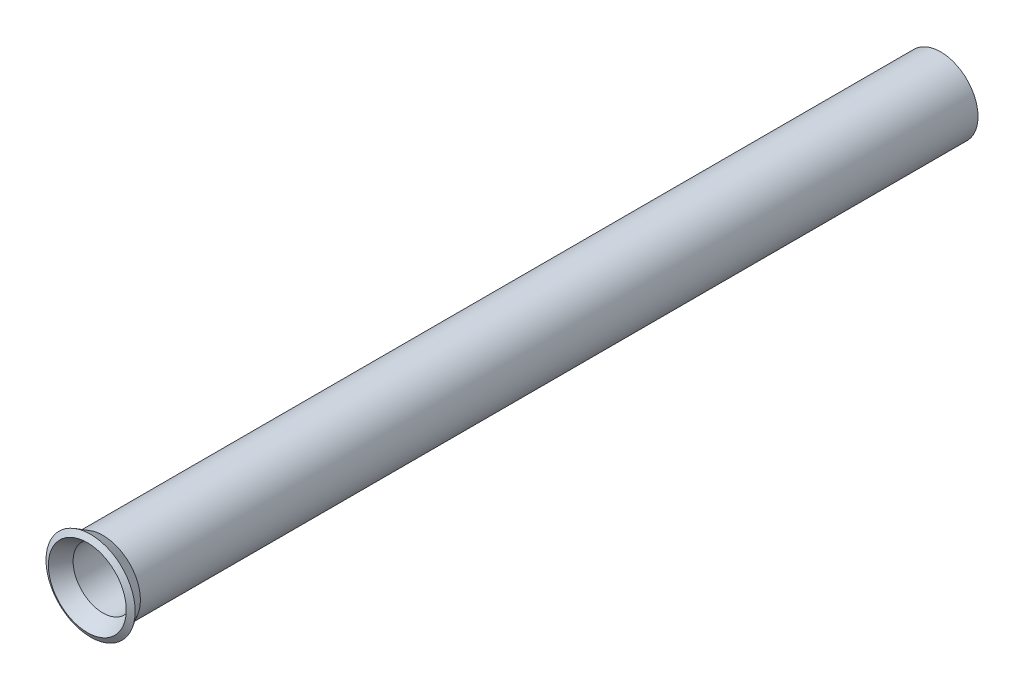
ISO-10303-21;
HEADER;
FILE_DESCRIPTION(('STEP AP214'),'2;1');
FILE_NAME('part.step','',(''),(''),'','','');
FILE_SCHEMA(('AUTOMOTIVE_DESIGN { 1 0 10303 214 1 1 1 1 }'));
ENDSEC;
DATA;
#1=APPLICATION_CONTEXT('core data for automotive mechanical design processes');
#2=APPLICATION_PROTOCOL_DEFINITION('international standard','automotive_design',2000,#1);
#3=PRODUCT_CONTEXT('',#1,'mechanical');
#4=PRODUCT('Part','Part','',(#3));
#5=PRODUCT_RELATED_PRODUCT_CATEGORY('part','',(#4));
#6=PRODUCT_DEFINITION_FORMATION('','',#4);
#7=PRODUCT_DEFINITION_CONTEXT('part definition',#1,'design');
#8=PRODUCT_DEFINITION('design','',#6,#7);
#9=PRODUCT_DEFINITION_SHAPE('','',#8);
#10=(LENGTH_UNIT() NAMED_UNIT(*) SI_UNIT(.MILLI.,.METRE.));
#11=(NAMED_UNIT(*) PLANE_ANGLE_UNIT() SI_UNIT($,.RADIAN.));
#12=(NAMED_UNIT(*) SI_UNIT($,.STERADIAN.) SOLID_ANGLE_UNIT());
#13=UNCERTAINTY_MEASURE_WITH_UNIT(LENGTH_MEASURE(1.E-05),#10,'distance_accuracy_value','');
#14=(GEOMETRIC_REPRESENTATION_CONTEXT(3) GLOBAL_UNCERTAINTY_ASSIGNED_CONTEXT((#13)) GLOBAL_UNIT_ASSIGNED_CONTEXT((#10,
#11,#12)) REPRESENTATION_CONTEXT('',''));
#15=CARTESIAN_POINT('',(0.,0.,0.));
#16=DIRECTION('',(0.,0.,1.));
#17=DIRECTION('',(1.,0.,0.));
#18=AXIS2_PLACEMENT_3D('',#15,#16,#17);
#19=CARTESIAN_POINT('',(0.,0.,0.));
#20=DIRECTION('',(0.,0.,1.));
#21=DIRECTION('',(1.,0.,0.));
#22=AXIS2_PLACEMENT_3D('',#19,#20,#21);
#23=PLANE('',#22);
#24=CARTESIAN_POINT('',(0.,0.,0.));
#25=DIRECTION('',(0.,0.,1.));
#26=DIRECTION('',(1.,0.,0.));
#27=AXIS2_PLACEMENT_3D('',#24,#25,#26);
#28=CIRCLE('',#27,1.5875);
#29=CARTESIAN_POINT('',(1.5875,0.,0.));
#30=VERTEX_POINT('',#29);
#31=EDGE_CURVE('E34',#30,#30,#28,.T.);
#32=ORIENTED_EDGE('',*,*,#31,.F.);
#33=EDGE_LOOP('',(#32));
#34=FACE_BOUND('',#33,.T.);
#35=CARTESIAN_POINT('',(0.,0.,0.));
#36=DIRECTION('',(0.,0.,1.));
#37=DIRECTION('',(1.,0.,0.));
#38=AXIS2_PLACEMENT_3D('',#35,#36,#37);
#39=CIRCLE('',#38,1.27);
#40=CARTESIAN_POINT('',(1.27,0.,0.));
#41=VERTEX_POINT('',#40);
#42=EDGE_CURVE('E41',#41,#41,#39,.T.);
#43=ORIENTED_EDGE('',*,*,#42,.T.);
#44=EDGE_LOOP('',(#43));
#45=FACE_BOUND('',#44,.T.);
#46=ADVANCED_FACE('F30',(#34,#45),#23,.F.);
#47=CARTESIAN_POINT('',(0.,0.,35.56));
#48=DIRECTION('',(0.,0.,-1.));
#49=DIRECTION('',(-1.,0.,0.));
#50=AXIS2_PLACEMENT_3D('',#47,#48,#49);
#51=CYLINDRICAL_SURFACE('',#50,1.5875);
#52=CARTESIAN_POINT('',(0.,0.,35.56));
#53=DIRECTION('',(0.,0.,1.));
#54=DIRECTION('',(1.,0.,0.));
#55=AXIS2_PLACEMENT_3D('',#52,#53,#54);
#56=CIRCLE('',#55,1.5875);
#57=CARTESIAN_POINT('',(1.5875,0.,35.56));
#58=VERTEX_POINT('',#57);
#59=EDGE_CURVE('E10',#58,#58,#56,.T.);
#60=ORIENTED_EDGE('',*,*,#59,.F.);
#61=EDGE_LOOP('',(#60));
#62=FACE_BOUND('',#61,.T.);
#63=ORIENTED_EDGE('',*,*,#31,.T.);
#64=EDGE_LOOP('',(#63));
#65=FACE_BOUND('',#64,.T.);
#66=ADVANCED_FACE('F32',(#62,#65),#51,.T.);
#67=CARTESIAN_POINT('',(0.,0.,35.56));
#68=DIRECTION('',(0.,0.,-1.));
#69=DIRECTION('',(-1.,0.,0.));
#70=AXIS2_PLACEMENT_3D('',#67,#68,#69);
#71=CYLINDRICAL_SURFACE('',#70,1.27);
#72=CARTESIAN_POINT('',(0.,0.,35.56));
#73=DIRECTION('',(0.,0.,-1.));
#74=DIRECTION('',(-1.,0.,0.));
#75=AXIS2_PLACEMENT_3D('',#72,#73,#74);
#76=CIRCLE('',#75,1.27);
#77=CARTESIAN_POINT('',(-1.27,0.,35.56));
#78=VERTEX_POINT('',#77);
#79=EDGE_CURVE('E51',#78,#78,#76,.T.);
#80=ORIENTED_EDGE('',*,*,#79,.F.);
#81=EDGE_LOOP('',(#80));
#82=FACE_BOUND('',#81,.T.);
#83=ORIENTED_EDGE('',*,*,#42,.F.);
#84=EDGE_LOOP('',(#83));
#85=FACE_BOUND('',#84,.T.);
#86=ADVANCED_FACE('F57',(#82,#85),#71,.F.);
#87=CARTESIAN_POINT('',(0.,0.,36.087929086147));
#88=DIRECTION('',(0.,0.,1.));
#89=DIRECTION('',(1.,0.,0.));
#90=AXIS2_PLACEMENT_3D('',#87,#88,#89);
#91=CONICAL_SURFACE('',#90,1.8923,0.523598775598292);
#92=ORIENTED_EDGE('',*,*,#59,.T.);
#93=EDGE_LOOP('',(#92));
#94=FACE_BOUND('',#93,.T.);
#95=CARTESIAN_POINT('',(0.,0.,36.087929086147));
#96=DIRECTION('',(0.,0.,-1.));
#97=DIRECTION('',(-1.,0.,0.));
#98=AXIS2_PLACEMENT_3D('',#95,#96,#97);
#99=CIRCLE('',#98,1.8923);
#100=CARTESIAN_POINT('',(-1.8923,0.,36.087929086147));
#101=VERTEX_POINT('',#100);
#102=EDGE_CURVE('E45',#101,#101,#99,.T.);
#103=ORIENTED_EDGE('',*,*,#102,.T.);
#104=EDGE_LOOP('',(#103));
#105=FACE_BOUND('',#104,.T.);
#106=ADVANCED_FACE('F60',(#94,#105),#91,.T.);
#107=CARTESIAN_POINT('',(0.,0.,36.2254106189978));
#108=DIRECTION('',(0.,0.,-1.));
#109=DIRECTION('',(-1.,0.,0.));
#110=AXIS2_PLACEMENT_3D('',#107,#108,#109);
#111=CONICAL_SURFACE('',#110,1.654175,1.04719755119657);
#112=ORIENTED_EDGE('',*,*,#102,.F.);
#113=EDGE_LOOP('',(#112));
#114=FACE_BOUND('',#113,.T.);
#115=CARTESIAN_POINT('',(0.,0.,36.2254106189978));
#116=DIRECTION('',(0.,0.,-1.));
#117=DIRECTION('',(-1.,0.,0.));
#118=AXIS2_PLACEMENT_3D('',#115,#116,#117);
#119=CIRCLE('',#118,1.654175);
#120=CARTESIAN_POINT('',(-1.654175,0.,36.2254106189978));
#121=VERTEX_POINT('',#120);
#122=EDGE_CURVE('E48',#121,#121,#119,.T.);
#123=ORIENTED_EDGE('',*,*,#122,.T.);
#124=EDGE_LOOP('',(#123));
#125=FACE_BOUND('',#124,.T.);
#126=ADVANCED_FACE('F74',(#114,#125),#111,.T.);
#127=CARTESIAN_POINT('',(0.,0.,35.56));
#128=DIRECTION('',(0.,0.,1.));
#129=DIRECTION('',(1.,0.,0.));
#130=AXIS2_PLACEMENT_3D('',#127,#128,#129);
#131=CONICAL_SURFACE('',#130,1.27,0.523598775598291);
#132=ORIENTED_EDGE('',*,*,#122,.F.);
#133=EDGE_LOOP('',(#132));
#134=FACE_BOUND('',#133,.T.);
#135=ORIENTED_EDGE('',*,*,#79,.T.);
#136=EDGE_LOOP('',(#135));
#137=FACE_BOUND('',#136,.T.);
#138=ADVANCED_FACE('F55',(#134,#137),#131,.F.);
#139=CLOSED_SHELL('',(#46,#66,#86,#106,#126,#138));
#140=MANIFOLD_SOLID_BREP('B2',#139);
#141=ADVANCED_BREP_SHAPE_REPRESENTATION('',(#18,#140),#14);
#142=SHAPE_DEFINITION_REPRESENTATION(#9,#141);
ENDSEC;
END-ISO-10303-21;
